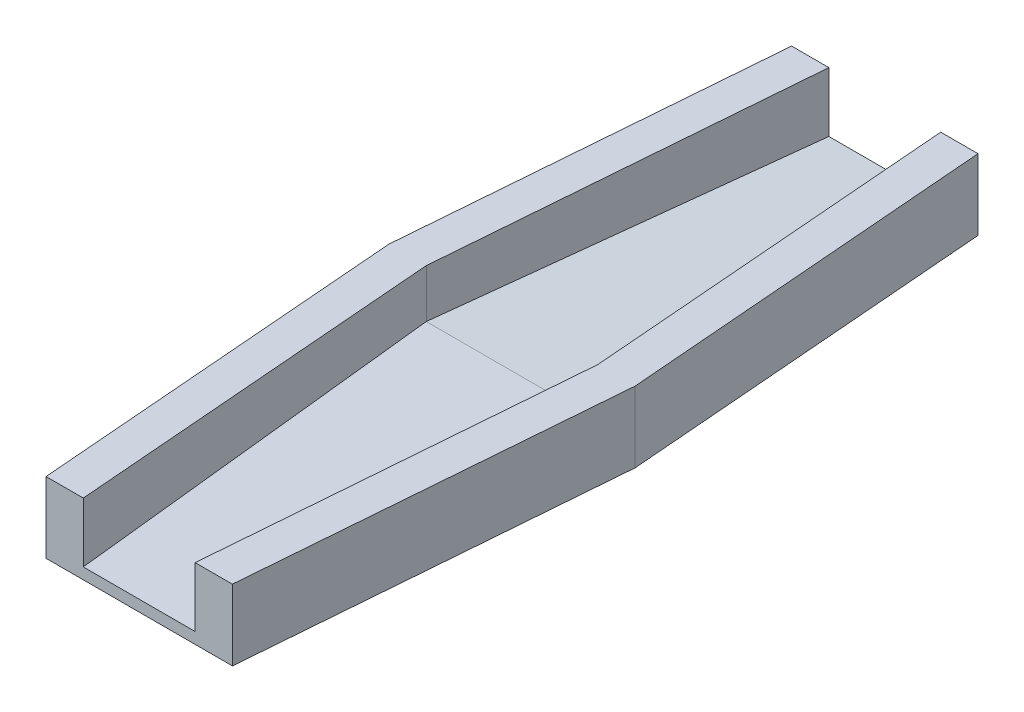
ISO-10303-21;
HEADER;
FILE_DESCRIPTION(('STEP AP214'),'2;1');
FILE_NAME('part.step','',(''),(''),'','','');
FILE_SCHEMA(('AUTOMOTIVE_DESIGN { 1 0 10303 214 1 1 1 1 }'));
ENDSEC;
DATA;
#1=APPLICATION_CONTEXT('core data for automotive mechanical design processes');
#2=APPLICATION_PROTOCOL_DEFINITION('international standard','automotive_design',2000,#1);
#3=PRODUCT_CONTEXT('',#1,'mechanical');
#4=PRODUCT('Part','Part','',(#3));
#5=PRODUCT_RELATED_PRODUCT_CATEGORY('part','',(#4));
#6=PRODUCT_DEFINITION_FORMATION('','',#4);
#7=PRODUCT_DEFINITION_CONTEXT('part definition',#1,'design');
#8=PRODUCT_DEFINITION('design','',#6,#7);
#9=PRODUCT_DEFINITION_SHAPE('','',#8);
#10=(LENGTH_UNIT() NAMED_UNIT(*) SI_UNIT(.MILLI.,.METRE.));
#11=(NAMED_UNIT(*) PLANE_ANGLE_UNIT() SI_UNIT($,.RADIAN.));
#12=(NAMED_UNIT(*) SI_UNIT($,.STERADIAN.) SOLID_ANGLE_UNIT());
#13=UNCERTAINTY_MEASURE_WITH_UNIT(LENGTH_MEASURE(1.E-05),#10,'distance_accuracy_value','');
#14=(GEOMETRIC_REPRESENTATION_CONTEXT(3) GLOBAL_UNCERTAINTY_ASSIGNED_CONTEXT((#13)) GLOBAL_UNIT_ASSIGNED_CONTEXT((#10,
#11,#12)) REPRESENTATION_CONTEXT('',''));
#15=CARTESIAN_POINT('',(0.,0.,0.));
#16=DIRECTION('',(0.,0.,1.));
#17=DIRECTION('',(1.,0.,0.));
#18=AXIS2_PLACEMENT_3D('',#15,#16,#17);
#19=CARTESIAN_POINT('',(-4.36182031470955,0.,80.));
#20=DIRECTION('',(0.,1.,0.));
#21=DIRECTION('',(0.,0.,1.));
#22=AXIS2_PLACEMENT_3D('',#19,#20,#21);
#23=PLANE('',#22);
#24=DIRECTION('',(-0.07974522228289,0.,-0.996815278536125));
#25=VECTOR('',#24,1.);
#26=CARTESIAN_POINT('',(8.61693595984286,0.,78.9616994980358));
#27=LINE('',#26,#25);
#28=CARTESIAN_POINT('',(2.3,0.,0.));
#29=VERTEX_POINT('',#28);
#30=CARTESIAN_POINT('',(1.5,0.,-10.));
#31=VERTEX_POINT('',#30);
#32=EDGE_CURVE('E430',#29,#31,#27,.T.);
#33=ORIENTED_EDGE('',*,*,#32,.F.);
#34=DIRECTION('',(0.07974522228289,0.,-0.996815278536125));
#35=VECTOR('',#34,1.);
#36=CARTESIAN_POINT('',(-4.1016649940522,0.,80.0208124256526));
#37=LINE('',#36,#35);
#38=CARTESIAN_POINT('',(1.5,0.,10.));
#39=VERTEX_POINT('',#38);
#40=EDGE_CURVE('E79',#39,#29,#37,.T.);
#41=ORIENTED_EDGE('',*,*,#40,.F.);
#42=DIRECTION('',(1.,0.,0.));
#43=VECTOR('',#42,1.);
#44=CARTESIAN_POINT('',(0.,0.,10.));
#45=LINE('',#44,#43);
#46=CARTESIAN_POINT('',(2.5,0.,10.));
#47=VERTEX_POINT('',#46);
#48=EDGE_CURVE('E374',#39,#47,#45,.T.);
#49=ORIENTED_EDGE('',*,*,#48,.T.);
#50=DIRECTION('',(0.0797452222828901,0.,-0.996815278536125));
#51=VECTOR('',#50,1.);
#52=CARTESIAN_POINT('',(3.27901430842607,0.,0.262321144674086));
#53=LINE('',#52,#51);
#54=CARTESIAN_POINT('',(3.3,0.,0.));
#55=VERTEX_POINT('',#54);
#56=EDGE_CURVE('E366',#47,#55,#53,.T.);
#57=ORIENTED_EDGE('',*,*,#56,.T.);
#58=DIRECTION('',(0.0797452222828901,0.,0.996815278536125));
#59=VECTOR('',#58,1.);
#60=CARTESIAN_POINT('',(3.27901430842607,0.,-0.262321144674086));
#61=LINE('',#60,#59);
#62=CARTESIAN_POINT('',(2.5,0.,-10.));
#63=VERTEX_POINT('',#62);
#64=EDGE_CURVE('E442',#63,#55,#61,.T.);
#65=ORIENTED_EDGE('',*,*,#64,.F.);
#66=DIRECTION('',(1.,0.,0.));
#67=VECTOR('',#66,1.);
#68=CARTESIAN_POINT('',(0.,0.,-10.));
#69=LINE('',#68,#67);
#70=EDGE_CURVE('E432',#31,#63,#69,.T.);
#71=ORIENTED_EDGE('',*,*,#70,.F.);
#72=EDGE_LOOP('',(#33,#41,#49,#57,#65,#71));
#73=FACE_BOUND('',#72,.T.);
#74=ADVANCED_FACE('F69',(#73),#23,.T.);
#75=CARTESIAN_POINT('',(0.,0.,10.));
#76=DIRECTION('',(0.,0.,-1.));
#77=DIRECTION('',(-1.,0.,0.));
#78=AXIS2_PLACEMENT_3D('',#75,#76,#77);
#79=PLANE('',#78);
#80=ORIENTED_EDGE('',*,*,#48,.F.);
#81=DIRECTION('',(0.,1.,0.));
#82=VECTOR('',#81,1.);
#83=CARTESIAN_POINT('',(1.5,-1.6,10.));
#84=LINE('',#83,#82);
#85=CARTESIAN_POINT('',(1.5,-1.6,10.));
#86=VERTEX_POINT('',#85);
#87=EDGE_CURVE('E208',#86,#39,#84,.T.);
#88=ORIENTED_EDGE('',*,*,#87,.F.);
#89=DIRECTION('',(1.,0.,0.));
#90=VECTOR('',#89,1.);
#91=CARTESIAN_POINT('',(-1.5,-1.6,10.));
#92=LINE('',#91,#90);
#93=CARTESIAN_POINT('',(-1.5,-1.6,10.));
#94=VERTEX_POINT('',#93);
#95=EDGE_CURVE('E207',#94,#86,#92,.T.);
#96=ORIENTED_EDGE('',*,*,#95,.F.);
#97=DIRECTION('',(0.,-1.,0.));
#98=VECTOR('',#97,1.);
#99=CARTESIAN_POINT('',(-1.5,-1.6,10.));
#100=LINE('',#99,#98);
#101=CARTESIAN_POINT('',(-1.5,0.,10.));
#102=VERTEX_POINT('',#101);
#103=EDGE_CURVE('E205',#102,#94,#100,.T.);
#104=ORIENTED_EDGE('',*,*,#103,.F.);
#105=CARTESIAN_POINT('',(-2.5,0.,10.));
#106=VERTEX_POINT('',#105);
#107=EDGE_CURVE('E352',#106,#102,#45,.T.);
#108=ORIENTED_EDGE('',*,*,#107,.F.);
#109=DIRECTION('',(0.,-1.,0.));
#110=VECTOR('',#109,1.);
#111=CARTESIAN_POINT('',(-2.5,-1.9,10.));
#112=LINE('',#111,#110);
#113=CARTESIAN_POINT('',(-2.5,-1.9,10.));
#114=VERTEX_POINT('',#113);
#115=EDGE_CURVE('E312',#106,#114,#112,.T.);
#116=ORIENTED_EDGE('',*,*,#115,.T.);
#117=DIRECTION('',(1.,0.,0.));
#118=VECTOR('',#117,1.);
#119=CARTESIAN_POINT('',(-2.5,-1.9,10.));
#120=LINE('',#119,#118);
#121=CARTESIAN_POINT('',(2.5,-1.9,10.));
#122=VERTEX_POINT('',#121);
#123=EDGE_CURVE('E94',#114,#122,#120,.T.);
#124=ORIENTED_EDGE('',*,*,#123,.T.);
#125=DIRECTION('',(0.,1.,0.));
#126=VECTOR('',#125,1.);
#127=CARTESIAN_POINT('',(2.5,-1.9,10.));
#128=LINE('',#127,#126);
#129=EDGE_CURVE('E259',#122,#47,#128,.T.);
#130=ORIENTED_EDGE('',*,*,#129,.T.);
#131=EDGE_LOOP('',(#80,#88,#96,#104,#108,#116,#124,#130));
#132=FACE_BOUND('',#131,.T.);
#133=ADVANCED_FACE('F71',(#132),#79,.F.);
#134=CARTESIAN_POINT('',(3.27901430842607,0.,0.262321144674086));
#135=DIRECTION('',(-0.996815278536125,0.,-0.0797452222828901));
#136=DIRECTION('',(-0.0797452222828901,0.,0.996815278536125));
#137=AXIS2_PLACEMENT_3D('',#134,#135,#136);
#138=PLANE('',#137);
#139=ORIENTED_EDGE('',*,*,#56,.F.);
#140=ORIENTED_EDGE('',*,*,#129,.F.);
#141=DIRECTION('',(-0.0797452222828901,0.,0.996815278536125));
#142=VECTOR('',#141,1.);
#143=CARTESIAN_POINT('',(3.3,-1.9,0.));
#144=LINE('',#143,#142);
#145=CARTESIAN_POINT('',(3.3,-1.9,0.));
#146=VERTEX_POINT('',#145);
#147=EDGE_CURVE('E355',#146,#122,#144,.T.);
#148=ORIENTED_EDGE('',*,*,#147,.F.);
#149=DIRECTION('',(0.,1.,0.));
#150=VECTOR('',#149,1.);
#151=CARTESIAN_POINT('',(3.3,-1.9,0.));
#152=LINE('',#151,#150);
#153=EDGE_CURVE('E369',#146,#55,#152,.T.);
#154=ORIENTED_EDGE('',*,*,#153,.T.);
#155=EDGE_LOOP('',(#139,#140,#148,#154));
#156=FACE_BOUND('',#155,.T.);
#157=ADVANCED_FACE('F267',(#156),#138,.F.);
#158=CARTESIAN_POINT('',(-3.27901430842607,0.,0.262321144674086));
#159=DIRECTION('',(0.996815278536125,0.,-0.07974522228289));
#160=DIRECTION('',(-0.07974522228289,0.,-0.996815278536125));
#161=AXIS2_PLACEMENT_3D('',#158,#159,#160);
#162=PLANE('',#161);
#163=DIRECTION('',(0.07974522228289,0.,0.996815278536125));
#164=VECTOR('',#163,1.);
#165=CARTESIAN_POINT('',(-3.27901430842607,0.,0.262321144674086));
#166=LINE('',#165,#164);
#167=CARTESIAN_POINT('',(-3.3,0.,0.));
#168=VERTEX_POINT('',#167);
#169=EDGE_CURVE('E307',#168,#106,#166,.T.);
#170=ORIENTED_EDGE('',*,*,#169,.F.);
#171=DIRECTION('',(0.,-1.,0.));
#172=VECTOR('',#171,1.);
#173=CARTESIAN_POINT('',(-3.3,-1.9,0.));
#174=LINE('',#173,#172);
#175=CARTESIAN_POINT('',(-3.3,-1.9,0.));
#176=VERTEX_POINT('',#175);
#177=EDGE_CURVE('E303',#168,#176,#174,.T.);
#178=ORIENTED_EDGE('',*,*,#177,.T.);
#179=DIRECTION('',(0.07974522228289,0.,0.996815278536125));
#180=VECTOR('',#179,1.);
#181=CARTESIAN_POINT('',(-3.3,-1.9,0.));
#182=LINE('',#181,#180);
#183=EDGE_CURVE('E353',#176,#114,#182,.T.);
#184=ORIENTED_EDGE('',*,*,#183,.T.);
#185=ORIENTED_EDGE('',*,*,#115,.F.);
#186=EDGE_LOOP('',(#170,#178,#184,#185));
#187=FACE_BOUND('',#186,.T.);
#188=ADVANCED_FACE('F241',(#187),#162,.F.);
#189=CARTESIAN_POINT('',(0.,-1.9,0.));
#190=DIRECTION('',(0.,1.,0.));
#191=DIRECTION('',(0.,0.,1.));
#192=AXIS2_PLACEMENT_3D('',#189,#190,#191);
#193=PLANE('',#192);
#194=ORIENTED_EDGE('',*,*,#147,.T.);
#195=ORIENTED_EDGE('',*,*,#123,.F.);
#196=ORIENTED_EDGE('',*,*,#183,.F.);
#197=DIRECTION('',(0.07974522228289,0.,-0.996815278536125));
#198=VECTOR('',#197,1.);
#199=CARTESIAN_POINT('',(-3.3,-1.9,0.));
#200=LINE('',#199,#198);
#201=CARTESIAN_POINT('',(-2.5,-1.9,-10.));
#202=VERTEX_POINT('',#201);
#203=EDGE_CURVE('E527',#176,#202,#200,.T.);
#204=ORIENTED_EDGE('',*,*,#203,.T.);
#205=DIRECTION('',(1.,0.,0.));
#206=VECTOR('',#205,1.);
#207=CARTESIAN_POINT('',(-2.5,-1.9,-10.));
#208=LINE('',#207,#206);
#209=CARTESIAN_POINT('',(2.5,-1.9,-10.));
#210=VERTEX_POINT('',#209);
#211=EDGE_CURVE('E216',#202,#210,#208,.T.);
#212=ORIENTED_EDGE('',*,*,#211,.T.);
#213=DIRECTION('',(-0.0797452222828901,0.,-0.996815278536125));
#214=VECTOR('',#213,1.);
#215=CARTESIAN_POINT('',(3.3,-1.9,0.));
#216=LINE('',#215,#214);
#217=EDGE_CURVE('E357',#146,#210,#216,.T.);
#218=ORIENTED_EDGE('',*,*,#217,.F.);
#219=EDGE_LOOP('',(#194,#195,#196,#204,#212,#218));
#220=FACE_BOUND('',#219,.T.);
#221=ADVANCED_FACE('F231',(#220),#193,.F.);
#222=DIRECTION('',(-0.07974522228289,0.,0.996815278536125));
#223=VECTOR('',#222,1.);
#224=CARTESIAN_POINT('',(-8.67241221185825,0.,79.6551526482281));
#225=LINE('',#224,#223);
#226=CARTESIAN_POINT('',(-1.5,0.,-10.));
#227=VERTEX_POINT('',#226);
#228=CARTESIAN_POINT('',(-2.3,0.,0.));
#229=VERTEX_POINT('',#228);
#230=EDGE_CURVE('E173',#227,#229,#225,.T.);
#231=ORIENTED_EDGE('',*,*,#230,.F.);
#232=CARTESIAN_POINT('',(-2.5,0.,-10.));
#233=VERTEX_POINT('',#232);
#234=EDGE_CURVE('E87',#233,#227,#69,.T.);
#235=ORIENTED_EDGE('',*,*,#234,.F.);
#236=DIRECTION('',(0.07974522228289,0.,-0.996815278536125));
#237=VECTOR('',#236,1.);
#238=CARTESIAN_POINT('',(-3.27901430842607,0.,-0.262321144674086));
#239=LINE('',#238,#237);
#240=EDGE_CURVE('E12',#168,#233,#239,.T.);
#241=ORIENTED_EDGE('',*,*,#240,.F.);
#242=ORIENTED_EDGE('',*,*,#169,.T.);
#243=ORIENTED_EDGE('',*,*,#107,.T.);
#244=DIRECTION('',(0.07974522228289,0.,0.996815278536125));
#245=VECTOR('',#244,1.);
#246=CARTESIAN_POINT('',(4.04618874203682,0.,79.3273592754603));
#247=LINE('',#246,#245);
#248=EDGE_CURVE('E309',#229,#102,#247,.T.);
#249=ORIENTED_EDGE('',*,*,#248,.F.);
#250=EDGE_LOOP('',(#231,#235,#241,#242,#243,#249));
#251=FACE_BOUND('',#250,.T.);
#252=ADVANCED_FACE('F240',(#251),#23,.T.);
#253=CARTESIAN_POINT('',(2.28537360890302,0.,0.182829888712242));
#254=DIRECTION('',(0.996815278536125,0.,0.07974522228289));
#255=DIRECTION('',(0.07974522228289,0.,-0.996815278536125));
#256=AXIS2_PLACEMENT_3D('',#253,#254,#255);
#257=PLANE('',#256);
#258=ORIENTED_EDGE('',*,*,#40,.T.);
#259=DIRECTION('',(0.,1.,0.));
#260=VECTOR('',#259,1.);
#261=CARTESIAN_POINT('',(2.3,-1.3,0.));
#262=LINE('',#261,#260);
#263=CARTESIAN_POINT('',(2.3,-1.3,0.));
#264=VERTEX_POINT('',#263);
#265=EDGE_CURVE('E189',#264,#29,#262,.T.);
#266=ORIENTED_EDGE('',*,*,#265,.F.);
#267=DIRECTION('',(0.0797095890362907,0.0298910958886091,-0.996369862953634));
#268=VECTOR('',#267,1.);
#269=CARTESIAN_POINT('',(1.5,-1.6,10.));
#270=LINE('',#269,#268);
#271=EDGE_CURVE('E212',#86,#264,#270,.T.);
#272=ORIENTED_EDGE('',*,*,#271,.F.);
#273=ORIENTED_EDGE('',*,*,#87,.T.);
#274=EDGE_LOOP('',(#258,#266,#272,#273));
#275=FACE_BOUND('',#274,.T.);
#276=ADVANCED_FACE('F408',(#275),#257,.F.);
#277=CARTESIAN_POINT('',(0.,-1.29883105205315,-0.0389649315615946));
#278=DIRECTION('',(0.,-0.999550303522367,-0.029986509105671));
#279=DIRECTION('',(0.,0.029986509105671,-0.999550303522367));
#280=AXIS2_PLACEMENT_3D('',#277,#278,#279);
#281=PLANE('',#280);
#282=DIRECTION('',(-0.0797095890362907,0.029891095888609,-0.996369862953634));
#283=VECTOR('',#282,1.);
#284=CARTESIAN_POINT('',(-1.5,-1.6,10.));
#285=LINE('',#284,#283);
#286=CARTESIAN_POINT('',(-2.3,-1.3,0.));
#287=VERTEX_POINT('',#286);
#288=EDGE_CURVE('E386',#94,#287,#285,.T.);
#289=ORIENTED_EDGE('',*,*,#288,.F.);
#290=ORIENTED_EDGE('',*,*,#95,.T.);
#291=ORIENTED_EDGE('',*,*,#271,.T.);
#292=DIRECTION('',(1.,0.,0.));
#293=VECTOR('',#292,1.);
#294=CARTESIAN_POINT('',(2.3,-1.3,0.));
#295=LINE('',#294,#293);
#296=EDGE_CURVE('E195',#287,#264,#295,.T.);
#297=ORIENTED_EDGE('',*,*,#296,.F.);
#298=EDGE_LOOP('',(#289,#290,#291,#297));
#299=FACE_BOUND('',#298,.T.);
#300=ADVANCED_FACE('F399',(#299),#281,.F.);
#301=CARTESIAN_POINT('',(-2.28537360890302,0.,0.182829888712242));
#302=DIRECTION('',(-0.996815278536125,0.,0.07974522228289));
#303=DIRECTION('',(0.07974522228289,0.,0.996815278536125));
#304=AXIS2_PLACEMENT_3D('',#301,#302,#303);
#305=PLANE('',#304);
#306=ORIENTED_EDGE('',*,*,#248,.T.);
#307=ORIENTED_EDGE('',*,*,#103,.T.);
#308=ORIENTED_EDGE('',*,*,#288,.T.);
#309=DIRECTION('',(0.,-1.,0.));
#310=VECTOR('',#309,1.);
#311=CARTESIAN_POINT('',(-2.3,-1.3,0.));
#312=LINE('',#311,#310);
#313=EDGE_CURVE('E168',#229,#287,#312,.T.);
#314=ORIENTED_EDGE('',*,*,#313,.F.);
#315=EDGE_LOOP('',(#306,#307,#308,#314));
#316=FACE_BOUND('',#315,.T.);
#317=ADVANCED_FACE('F407',(#316),#305,.F.);
#318=CARTESIAN_POINT('',(0.,0.,-10.));
#319=DIRECTION('',(0.,0.,1.));
#320=DIRECTION('',(-1.,0.,0.));
#321=AXIS2_PLACEMENT_3D('',#318,#319,#320);
#322=PLANE('',#321);
#323=DIRECTION('',(1.,0.,0.));
#324=VECTOR('',#323,1.);
#325=CARTESIAN_POINT('',(-1.5,-1.6,-10.));
#326=LINE('',#325,#324);
#327=CARTESIAN_POINT('',(-1.5,-1.6,-10.));
#328=VERTEX_POINT('',#327);
#329=CARTESIAN_POINT('',(1.5,-1.6,-10.));
#330=VERTEX_POINT('',#329);
#331=EDGE_CURVE('E177',#328,#330,#326,.T.);
#332=ORIENTED_EDGE('',*,*,#331,.T.);
#333=DIRECTION('',(0.,1.,0.));
#334=VECTOR('',#333,1.);
#335=CARTESIAN_POINT('',(1.5,-1.6,-10.));
#336=LINE('',#335,#334);
#337=EDGE_CURVE('E185',#330,#31,#336,.T.);
#338=ORIENTED_EDGE('',*,*,#337,.T.);
#339=ORIENTED_EDGE('',*,*,#70,.T.);
#340=DIRECTION('',(0.,1.,0.));
#341=VECTOR('',#340,1.);
#342=CARTESIAN_POINT('',(2.5,-1.9,-10.));
#343=LINE('',#342,#341);
#344=EDGE_CURVE('E449',#210,#63,#343,.T.);
#345=ORIENTED_EDGE('',*,*,#344,.F.);
#346=ORIENTED_EDGE('',*,*,#211,.F.);
#347=DIRECTION('',(0.,-1.,0.));
#348=VECTOR('',#347,1.);
#349=CARTESIAN_POINT('',(-2.5,-1.9,-10.));
#350=LINE('',#349,#348);
#351=EDGE_CURVE('E505',#233,#202,#350,.T.);
#352=ORIENTED_EDGE('',*,*,#351,.F.);
#353=ORIENTED_EDGE('',*,*,#234,.T.);
#354=DIRECTION('',(0.,-1.,0.));
#355=VECTOR('',#354,1.);
#356=CARTESIAN_POINT('',(-1.5,-1.6,-10.));
#357=LINE('',#356,#355);
#358=EDGE_CURVE('E166',#227,#328,#357,.T.);
#359=ORIENTED_EDGE('',*,*,#358,.T.);
#360=EDGE_LOOP('',(#332,#338,#339,#345,#346,#352,#353,#359));
#361=FACE_BOUND('',#360,.T.);
#362=ADVANCED_FACE('F183',(#361),#322,.F.);
#363=CARTESIAN_POINT('',(3.27901430842607,0.,-0.262321144674086));
#364=DIRECTION('',(-0.996815278536125,0.,0.0797452222828901));
#365=DIRECTION('',(-0.0797452222828901,0.,-0.996815278536125));
#366=AXIS2_PLACEMENT_3D('',#363,#364,#365);
#367=PLANE('',#366);
#368=ORIENTED_EDGE('',*,*,#344,.T.);
#369=ORIENTED_EDGE('',*,*,#64,.T.);
#370=ORIENTED_EDGE('',*,*,#153,.F.);
#371=ORIENTED_EDGE('',*,*,#217,.T.);
#372=EDGE_LOOP('',(#368,#369,#370,#371));
#373=FACE_BOUND('',#372,.T.);
#374=ADVANCED_FACE('F417',(#373),#367,.F.);
#375=CARTESIAN_POINT('',(-3.27901430842607,0.,-0.262321144674086));
#376=DIRECTION('',(0.996815278536125,0.,0.07974522228289));
#377=DIRECTION('',(-0.07974522228289,0.,0.996815278536125));
#378=AXIS2_PLACEMENT_3D('',#375,#376,#377);
#379=PLANE('',#378);
#380=ORIENTED_EDGE('',*,*,#177,.F.);
#381=ORIENTED_EDGE('',*,*,#240,.T.);
#382=ORIENTED_EDGE('',*,*,#351,.T.);
#383=ORIENTED_EDGE('',*,*,#203,.F.);
#384=EDGE_LOOP('',(#380,#381,#382,#383));
#385=FACE_BOUND('',#384,.T.);
#386=ADVANCED_FACE('F476',(#385),#379,.F.);
#387=CARTESIAN_POINT('',(2.28537360890302,0.,-0.182829888712242));
#388=DIRECTION('',(0.996815278536125,0.,-0.07974522228289));
#389=DIRECTION('',(0.07974522228289,0.,0.996815278536125));
#390=AXIS2_PLACEMENT_3D('',#387,#388,#389);
#391=PLANE('',#390);
#392=ORIENTED_EDGE('',*,*,#32,.T.);
#393=ORIENTED_EDGE('',*,*,#337,.F.);
#394=DIRECTION('',(0.0797095890362907,0.0298910958886091,0.996369862953634));
#395=VECTOR('',#394,1.);
#396=CARTESIAN_POINT('',(1.5,-1.6,-10.));
#397=LINE('',#396,#395);
#398=EDGE_CURVE('E174',#330,#264,#397,.T.);
#399=ORIENTED_EDGE('',*,*,#398,.T.);
#400=ORIENTED_EDGE('',*,*,#265,.T.);
#401=EDGE_LOOP('',(#392,#393,#399,#400));
#402=FACE_BOUND('',#401,.T.);
#403=ADVANCED_FACE('F484',(#402),#391,.F.);
#404=CARTESIAN_POINT('',(0.,-1.29883105205315,0.0389649315615946));
#405=DIRECTION('',(0.,-0.999550303522367,0.029986509105671));
#406=DIRECTION('',(0.,0.029986509105671,0.999550303522367));
#407=AXIS2_PLACEMENT_3D('',#404,#405,#406);
#408=PLANE('',#407);
#409=DIRECTION('',(-0.0797095890362907,0.029891095888609,0.996369862953634));
#410=VECTOR('',#409,1.);
#411=CARTESIAN_POINT('',(-1.5,-1.6,-10.));
#412=LINE('',#411,#410);
#413=EDGE_CURVE('E162',#328,#287,#412,.T.);
#414=ORIENTED_EDGE('',*,*,#413,.T.);
#415=ORIENTED_EDGE('',*,*,#296,.T.);
#416=ORIENTED_EDGE('',*,*,#398,.F.);
#417=ORIENTED_EDGE('',*,*,#331,.F.);
#418=EDGE_LOOP('',(#414,#415,#416,#417));
#419=FACE_BOUND('',#418,.T.);
#420=ADVANCED_FACE('F178',(#419),#408,.F.);
#421=CARTESIAN_POINT('',(-2.28537360890302,0.,-0.182829888712242));
#422=DIRECTION('',(-0.996815278536125,0.,-0.07974522228289));
#423=DIRECTION('',(0.07974522228289,0.,-0.996815278536125));
#424=AXIS2_PLACEMENT_3D('',#421,#422,#423);
#425=PLANE('',#424);
#426=ORIENTED_EDGE('',*,*,#230,.T.);
#427=ORIENTED_EDGE('',*,*,#313,.T.);
#428=ORIENTED_EDGE('',*,*,#413,.F.);
#429=ORIENTED_EDGE('',*,*,#358,.F.);
#430=EDGE_LOOP('',(#426,#427,#428,#429));
#431=FACE_BOUND('',#430,.T.);
#432=ADVANCED_FACE('F164',(#431),#425,.F.);
#433=CLOSED_SHELL('',(#74,#133,#157,#188,#221,#252,#276,#300,#317,#362,#374,#386,#403,#420,#432));
#434=MANIFOLD_SOLID_BREP('B2',#433);
#435=ADVANCED_BREP_SHAPE_REPRESENTATION('',(#18,#434),#14);
#436=SHAPE_DEFINITION_REPRESENTATION(#9,#435);
ENDSEC;
END-ISO-10303-21;
